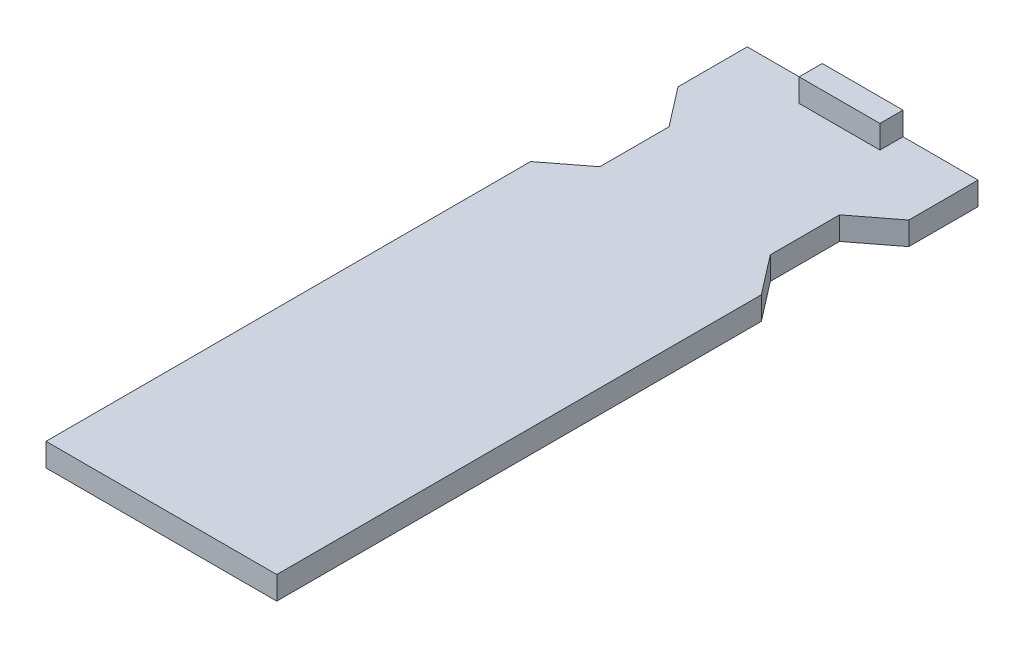
ISO-10303-21;
HEADER;
FILE_DESCRIPTION(('STEP AP214'),'2;1');
FILE_NAME('part.step','',(''),(''),'','','');
FILE_SCHEMA(('AUTOMOTIVE_DESIGN { 1 0 10303 214 1 1 1 1 }'));
ENDSEC;
DATA;
#1=APPLICATION_CONTEXT('core data for automotive mechanical design processes');
#2=APPLICATION_PROTOCOL_DEFINITION('international standard','automotive_design',2000,#1);
#3=PRODUCT_CONTEXT('',#1,'mechanical');
#4=PRODUCT('Part','Part','',(#3));
#5=PRODUCT_RELATED_PRODUCT_CATEGORY('part','',(#4));
#6=PRODUCT_DEFINITION_FORMATION('','',#4);
#7=PRODUCT_DEFINITION_CONTEXT('part definition',#1,'design');
#8=PRODUCT_DEFINITION('design','',#6,#7);
#9=PRODUCT_DEFINITION_SHAPE('','',#8);
#10=(LENGTH_UNIT() NAMED_UNIT(*) SI_UNIT(.MILLI.,.METRE.));
#11=(NAMED_UNIT(*) PLANE_ANGLE_UNIT() SI_UNIT($,.RADIAN.));
#12=(NAMED_UNIT(*) SI_UNIT($,.STERADIAN.) SOLID_ANGLE_UNIT());
#13=UNCERTAINTY_MEASURE_WITH_UNIT(LENGTH_MEASURE(1.E-05),#10,'distance_accuracy_value','');
#14=(GEOMETRIC_REPRESENTATION_CONTEXT(3) GLOBAL_UNCERTAINTY_ASSIGNED_CONTEXT((#13)) GLOBAL_UNIT_ASSIGNED_CONTEXT((#10,
#11,#12)) REPRESENTATION_CONTEXT('',''));
#15=CARTESIAN_POINT('',(0.,0.,0.));
#16=DIRECTION('',(0.,0.,1.));
#17=DIRECTION('',(1.,0.,0.));
#18=AXIS2_PLACEMENT_3D('',#15,#16,#17);
#19=CARTESIAN_POINT('',(7.27930973975201,4.,-60.));
#20=DIRECTION('',(1.,0.,0.));
#21=DIRECTION('',(0.,0.,-1.));
#22=AXIS2_PLACEMENT_3D('',#19,#20,#21);
#23=PLANE('',#22);
#24=DIRECTION('',(0.,0.,1.));
#25=VECTOR('',#24,1.);
#26=CARTESIAN_POINT('',(7.27930973975201,2.,-60.));
#27=LINE('',#26,#25);
#28=CARTESIAN_POINT('',(7.27930973975201,2.,-60.));
#29=VERTEX_POINT('',#28);
#30=CARTESIAN_POINT('',(7.27930973975201,2.,-58.));
#31=VERTEX_POINT('',#30);
#32=EDGE_CURVE('E108',#29,#31,#27,.T.);
#33=ORIENTED_EDGE('',*,*,#32,.T.);
#34=DIRECTION('',(0.,-1.,0.));
#35=VECTOR('',#34,1.);
#36=CARTESIAN_POINT('',(7.27930973975201,4.,-58.));
#37=LINE('',#36,#35);
#38=CARTESIAN_POINT('',(7.27930973975201,4.,-58.));
#39=VERTEX_POINT('',#38);
#40=EDGE_CURVE('E12',#39,#31,#37,.T.);
#41=ORIENTED_EDGE('',*,*,#40,.F.);
#42=DIRECTION('',(0.,0.,1.));
#43=VECTOR('',#42,1.);
#44=CARTESIAN_POINT('',(7.27930973975201,4.,-60.));
#45=LINE('',#44,#43);
#46=CARTESIAN_POINT('',(7.27930973975201,4.,-60.));
#47=VERTEX_POINT('',#46);
#48=EDGE_CURVE('E96',#47,#39,#45,.T.);
#49=ORIENTED_EDGE('',*,*,#48,.F.);
#50=DIRECTION('',(0.,-1.,0.));
#51=VECTOR('',#50,1.);
#52=CARTESIAN_POINT('',(7.27930973975201,4.,-60.));
#53=LINE('',#52,#51);
#54=EDGE_CURVE('E104',#47,#29,#53,.T.);
#55=ORIENTED_EDGE('',*,*,#54,.T.);
#56=EDGE_LOOP('',(#33,#41,#49,#55));
#57=FACE_BOUND('',#56,.T.);
#58=ADVANCED_FACE('F45',(#57),#23,.F.);
#59=CARTESIAN_POINT('',(7.27930973975201,4.,-58.));
#60=DIRECTION('',(0.,0.,-1.));
#61=DIRECTION('',(-1.,0.,0.));
#62=AXIS2_PLACEMENT_3D('',#59,#60,#61);
#63=PLANE('',#62);
#64=DIRECTION('',(1.,0.,0.));
#65=VECTOR('',#64,1.);
#66=CARTESIAN_POINT('',(7.27930973975201,2.,-58.));
#67=LINE('',#66,#65);
#68=CARTESIAN_POINT('',(14.279309739752,2.,-58.));
#69=VERTEX_POINT('',#68);
#70=EDGE_CURVE('E100',#31,#69,#67,.T.);
#71=ORIENTED_EDGE('',*,*,#70,.T.);
#72=DIRECTION('',(0.,-1.,0.));
#73=VECTOR('',#72,1.);
#74=CARTESIAN_POINT('',(14.279309739752,4.,-58.));
#75=LINE('',#74,#73);
#76=CARTESIAN_POINT('',(14.279309739752,4.,-58.));
#77=VERTEX_POINT('',#76);
#78=EDGE_CURVE('E53',#77,#69,#75,.T.);
#79=ORIENTED_EDGE('',*,*,#78,.F.);
#80=DIRECTION('',(1.,0.,0.));
#81=VECTOR('',#80,1.);
#82=CARTESIAN_POINT('',(7.27930973975201,4.,-58.));
#83=LINE('',#82,#81);
#84=EDGE_CURVE('E91',#39,#77,#83,.T.);
#85=ORIENTED_EDGE('',*,*,#84,.F.);
#86=ORIENTED_EDGE('',*,*,#40,.T.);
#87=EDGE_LOOP('',(#71,#79,#85,#86));
#88=FACE_BOUND('',#87,.T.);
#89=ADVANCED_FACE('F99',(#88),#63,.F.);
#90=CARTESIAN_POINT('',(14.279309739752,4.,-60.));
#91=DIRECTION('',(-1.,0.,0.));
#92=DIRECTION('',(0.,0.,1.));
#93=AXIS2_PLACEMENT_3D('',#90,#91,#92);
#94=PLANE('',#93);
#95=DIRECTION('',(0.,0.,-1.));
#96=VECTOR('',#95,1.);
#97=CARTESIAN_POINT('',(14.279309739752,2.,-60.));
#98=LINE('',#97,#96);
#99=CARTESIAN_POINT('',(14.279309739752,2.,-60.));
#100=VERTEX_POINT('',#99);
#101=EDGE_CURVE('E78',#69,#100,#98,.T.);
#102=ORIENTED_EDGE('',*,*,#101,.T.);
#103=DIRECTION('',(0.,-1.,0.));
#104=VECTOR('',#103,1.);
#105=CARTESIAN_POINT('',(14.279309739752,4.,-60.));
#106=LINE('',#105,#104);
#107=CARTESIAN_POINT('',(14.279309739752,4.,-60.));
#108=VERTEX_POINT('',#107);
#109=EDGE_CURVE('E101',#108,#100,#106,.T.);
#110=ORIENTED_EDGE('',*,*,#109,.F.);
#111=DIRECTION('',(0.,0.,-1.));
#112=VECTOR('',#111,1.);
#113=CARTESIAN_POINT('',(14.279309739752,4.,-60.));
#114=LINE('',#113,#112);
#115=EDGE_CURVE('E94',#77,#108,#114,.T.);
#116=ORIENTED_EDGE('',*,*,#115,.F.);
#117=ORIENTED_EDGE('',*,*,#78,.T.);
#118=EDGE_LOOP('',(#102,#110,#116,#117));
#119=FACE_BOUND('',#118,.T.);
#120=ADVANCED_FACE('F102',(#119),#94,.F.);
#121=CARTESIAN_POINT('',(7.27930973975201,4.,-60.));
#122=DIRECTION('',(0.,0.,1.));
#123=DIRECTION('',(1.,0.,0.));
#124=AXIS2_PLACEMENT_3D('',#121,#122,#123);
#125=PLANE('',#124);
#126=DIRECTION('',(-1.,0.,0.));
#127=VECTOR('',#126,1.);
#128=CARTESIAN_POINT('',(7.27930973975201,2.,-60.));
#129=LINE('',#128,#127);
#130=EDGE_CURVE('E84',#100,#29,#129,.T.);
#131=ORIENTED_EDGE('',*,*,#130,.T.);
#132=ORIENTED_EDGE('',*,*,#54,.F.);
#133=DIRECTION('',(-1.,0.,0.));
#134=VECTOR('',#133,1.);
#135=CARTESIAN_POINT('',(7.27930973975201,4.,-60.));
#136=LINE('',#135,#134);
#137=EDGE_CURVE('E61',#108,#47,#136,.T.);
#138=ORIENTED_EDGE('',*,*,#137,.F.);
#139=ORIENTED_EDGE('',*,*,#109,.T.);
#140=EDGE_LOOP('',(#131,#132,#138,#139));
#141=FACE_BOUND('',#140,.T.);
#142=ADVANCED_FACE('F115',(#141),#125,.F.);
#143=CARTESIAN_POINT('',(0.,4.,0.));
#144=DIRECTION('',(0.,1.,0.));
#145=DIRECTION('',(0.,0.,1.));
#146=AXIS2_PLACEMENT_3D('',#143,#144,#145);
#147=PLANE('',#146);
#148=ORIENTED_EDGE('',*,*,#48,.T.);
#149=ORIENTED_EDGE('',*,*,#84,.T.);
#150=ORIENTED_EDGE('',*,*,#115,.T.);
#151=ORIENTED_EDGE('',*,*,#137,.T.);
#152=EDGE_LOOP('',(#148,#149,#150,#151));
#153=FACE_BOUND('',#152,.T.);
#154=ADVANCED_FACE('F92',(#153),#147,.T.);
#155=CARTESIAN_POINT('',(0.,2.,0.));
#156=DIRECTION('',(0.,1.,0.));
#157=DIRECTION('',(0.,0.,1.));
#158=AXIS2_PLACEMENT_3D('',#155,#156,#157);
#159=PLANE('',#158);
#160=ORIENTED_EDGE('',*,*,#32,.F.);
#161=ORIENTED_EDGE('',*,*,#130,.F.);
#162=ORIENTED_EDGE('',*,*,#101,.F.);
#163=ORIENTED_EDGE('',*,*,#70,.F.);
#164=EDGE_LOOP('',(#160,#161,#162,#163));
#165=FACE_BOUND('',#164,.T.);
#166=ADVANCED_FACE('F118',(#165),#159,.F.);
#167=CLOSED_SHELL('',(#58,#89,#120,#142,#154,#166));
#168=MANIFOLD_SOLID_BREP('B2',#167);
#169=CARTESIAN_POINT('',(0.,2.,0.));
#170=DIRECTION('',(0.,0.,-1.));
#171=DIRECTION('',(-1.,0.,0.));
#172=AXIS2_PLACEMENT_3D('',#169,#170,#171);
#173=PLANE('',#172);
#174=DIRECTION('',(1.,0.,0.));
#175=VECTOR('',#174,1.);
#176=CARTESIAN_POINT('',(0.,0.,0.));
#177=LINE('',#176,#175);
#178=CARTESIAN_POINT('',(0.,0.,0.));
#179=VERTEX_POINT('',#178);
#180=CARTESIAN_POINT('',(20.,0.,0.));
#181=VERTEX_POINT('',#180);
#182=EDGE_CURVE('E289',#179,#181,#177,.T.);
#183=ORIENTED_EDGE('',*,*,#182,.T.);
#184=DIRECTION('',(0.,-1.,0.));
#185=VECTOR('',#184,1.);
#186=CARTESIAN_POINT('',(20.,2.,0.));
#187=LINE('',#186,#185);
#188=CARTESIAN_POINT('',(20.,2.,0.));
#189=VERTEX_POINT('',#188);
#190=EDGE_CURVE('E43',#189,#181,#187,.T.);
#191=ORIENTED_EDGE('',*,*,#190,.F.);
#192=DIRECTION('',(1.,0.,0.));
#193=VECTOR('',#192,1.);
#194=CARTESIAN_POINT('',(0.,2.,0.));
#195=LINE('',#194,#193);
#196=CARTESIAN_POINT('',(0.,2.,0.));
#197=VERTEX_POINT('',#196);
#198=EDGE_CURVE('E311',#197,#189,#195,.T.);
#199=ORIENTED_EDGE('',*,*,#198,.F.);
#200=DIRECTION('',(0.,-1.,0.));
#201=VECTOR('',#200,1.);
#202=CARTESIAN_POINT('',(0.,2.,0.));
#203=LINE('',#202,#201);
#204=EDGE_CURVE('E285',#197,#179,#203,.T.);
#205=ORIENTED_EDGE('',*,*,#204,.T.);
#206=EDGE_LOOP('',(#183,#191,#199,#205));
#207=FACE_BOUND('',#206,.T.);
#208=ADVANCED_FACE('F169',(#207),#173,.F.);
#209=CARTESIAN_POINT('',(20.,2.,0.));
#210=DIRECTION('',(-1.,0.,0.));
#211=DIRECTION('',(0.,0.,1.));
#212=AXIS2_PLACEMENT_3D('',#209,#210,#211);
#213=PLANE('',#212);
#214=DIRECTION('',(0.,0.,-1.));
#215=VECTOR('',#214,1.);
#216=CARTESIAN_POINT('',(20.,0.,0.));
#217=LINE('',#216,#215);
#218=CARTESIAN_POINT('',(20.,0.,-42.));
#219=VERTEX_POINT('',#218);
#220=EDGE_CURVE('E292',#181,#219,#217,.T.);
#221=ORIENTED_EDGE('',*,*,#220,.T.);
#222=DIRECTION('',(0.,-1.,0.));
#223=VECTOR('',#222,1.);
#224=CARTESIAN_POINT('',(20.,2.,-42.));
#225=LINE('',#224,#223);
#226=CARTESIAN_POINT('',(20.,2.,-42.));
#227=VERTEX_POINT('',#226);
#228=EDGE_CURVE('E177',#227,#219,#225,.T.);
#229=ORIENTED_EDGE('',*,*,#228,.F.);
#230=DIRECTION('',(0.,0.,-1.));
#231=VECTOR('',#230,1.);
#232=CARTESIAN_POINT('',(20.,2.,0.));
#233=LINE('',#232,#231);
#234=EDGE_CURVE('E240',#189,#227,#233,.T.);
#235=ORIENTED_EDGE('',*,*,#234,.F.);
#236=ORIENTED_EDGE('',*,*,#190,.T.);
#237=EDGE_LOOP('',(#221,#229,#235,#236));
#238=FACE_BOUND('',#237,.T.);
#239=ADVANCED_FACE('F389',(#238),#213,.F.);
#240=CARTESIAN_POINT('',(20.,2.,-42.));
#241=DIRECTION('',(-0.7922942232558,0.,0.610139216732943));
#242=DIRECTION('',(0.610139216732943,0.,0.7922942232558));
#243=AXIS2_PLACEMENT_3D('',#240,#241,#242);
#244=PLANE('',#243);
#245=DIRECTION('',(-0.610139216732943,0.,-0.7922942232558));
#246=VECTOR('',#245,1.);
#247=CARTESIAN_POINT('',(20.,0.,-42.));
#248=LINE('',#247,#246);
#249=CARTESIAN_POINT('',(17.389654869876,0.,-45.389654869876));
#250=VERTEX_POINT('',#249);
#251=EDGE_CURVE('E294',#219,#250,#248,.T.);
#252=ORIENTED_EDGE('',*,*,#251,.T.);
#253=DIRECTION('',(0.,-1.,0.));
#254=VECTOR('',#253,1.);
#255=CARTESIAN_POINT('',(17.389654869876,2.,-45.389654869876));
#256=LINE('',#255,#254);
#257=CARTESIAN_POINT('',(17.389654869876,2.,-45.389654869876));
#258=VERTEX_POINT('',#257);
#259=EDGE_CURVE('E330',#258,#250,#256,.T.);
#260=ORIENTED_EDGE('',*,*,#259,.F.);
#261=DIRECTION('',(-0.610139216732943,0.,-0.7922942232558));
#262=VECTOR('',#261,1.);
#263=CARTESIAN_POINT('',(20.,2.,-42.));
#264=LINE('',#263,#262);
#265=EDGE_CURVE('E338',#227,#258,#264,.T.);
#266=ORIENTED_EDGE('',*,*,#265,.F.);
#267=ORIENTED_EDGE('',*,*,#228,.T.);
#268=EDGE_LOOP('',(#252,#260,#266,#267));
#269=FACE_BOUND('',#268,.T.);
#270=ADVANCED_FACE('F336',(#269),#244,.F.);
#271=CARTESIAN_POINT('',(17.389654869876,2.,-45.389654869876));
#272=DIRECTION('',(-1.,0.,0.));
#273=DIRECTION('',(0.,0.,1.));
#274=AXIS2_PLACEMENT_3D('',#271,#272,#273);
#275=PLANE('',#274);
#276=DIRECTION('',(0.,0.,-1.));
#277=VECTOR('',#276,1.);
#278=CARTESIAN_POINT('',(17.389654869876,0.,-45.389654869876));
#279=LINE('',#278,#277);
#280=CARTESIAN_POINT('',(17.389654869876,0.,-51.389654869876));
#281=VERTEX_POINT('',#280);
#282=EDGE_CURVE('E296',#250,#281,#279,.T.);
#283=ORIENTED_EDGE('',*,*,#282,.T.);
#284=DIRECTION('',(0.,-1.,0.));
#285=VECTOR('',#284,1.);
#286=CARTESIAN_POINT('',(17.389654869876,2.,-51.389654869876));
#287=LINE('',#286,#285);
#288=CARTESIAN_POINT('',(17.389654869876,2.,-51.389654869876));
#289=VERTEX_POINT('',#288);
#290=EDGE_CURVE('E327',#289,#281,#287,.T.);
#291=ORIENTED_EDGE('',*,*,#290,.F.);
#292=DIRECTION('',(0.,0.,-1.));
#293=VECTOR('',#292,1.);
#294=CARTESIAN_POINT('',(17.389654869876,2.,-45.389654869876));
#295=LINE('',#294,#293);
#296=EDGE_CURVE('E356',#258,#289,#295,.T.);
#297=ORIENTED_EDGE('',*,*,#296,.F.);
#298=ORIENTED_EDGE('',*,*,#259,.T.);
#299=EDGE_LOOP('',(#283,#291,#297,#298));
#300=FACE_BOUND('',#299,.T.);
#301=ADVANCED_FACE('F347',(#300),#275,.F.);
#302=CARTESIAN_POINT('',(17.389654869876,2.,-51.389654869876));
#303=DIRECTION('',(-0.610139216732944,0.,-0.792294223255799));
#304=DIRECTION('',(-0.792294223255799,0.,0.610139216732944));
#305=AXIS2_PLACEMENT_3D('',#302,#303,#304);
#306=PLANE('',#305);
#307=DIRECTION('',(0.792294223255799,0.,-0.610139216732944));
#308=VECTOR('',#307,1.);
#309=CARTESIAN_POINT('',(17.389654869876,0.,-51.389654869876));
#310=LINE('',#309,#308);
#311=CARTESIAN_POINT('',(20.779309739752,0.,-54.));
#312=VERTEX_POINT('',#311);
#313=EDGE_CURVE('E298',#281,#312,#310,.T.);
#314=ORIENTED_EDGE('',*,*,#313,.T.);
#315=DIRECTION('',(0.,-1.,0.));
#316=VECTOR('',#315,1.);
#317=CARTESIAN_POINT('',(20.779309739752,2.,-54.));
#318=LINE('',#317,#316);
#319=CARTESIAN_POINT('',(20.779309739752,2.,-54.));
#320=VERTEX_POINT('',#319);
#321=EDGE_CURVE('E324',#320,#312,#318,.T.);
#322=ORIENTED_EDGE('',*,*,#321,.F.);
#323=DIRECTION('',(0.792294223255799,0.,-0.610139216732944));
#324=VECTOR('',#323,1.);
#325=CARTESIAN_POINT('',(17.389654869876,2.,-51.389654869876));
#326=LINE('',#325,#324);
#327=EDGE_CURVE('E353',#289,#320,#326,.T.);
#328=ORIENTED_EDGE('',*,*,#327,.F.);
#329=ORIENTED_EDGE('',*,*,#290,.T.);
#330=EDGE_LOOP('',(#314,#322,#328,#329));
#331=FACE_BOUND('',#330,.T.);
#332=ADVANCED_FACE('F351',(#331),#306,.F.);
#333=CARTESIAN_POINT('',(20.779309739752,2.,-54.));
#334=DIRECTION('',(-1.,0.,0.));
#335=DIRECTION('',(0.,0.,1.));
#336=AXIS2_PLACEMENT_3D('',#333,#334,#335);
#337=PLANE('',#336);
#338=DIRECTION('',(0.,0.,-1.));
#339=VECTOR('',#338,1.);
#340=CARTESIAN_POINT('',(20.779309739752,0.,-54.));
#341=LINE('',#340,#339);
#342=CARTESIAN_POINT('',(20.779309739752,0.,-60.));
#343=VERTEX_POINT('',#342);
#344=EDGE_CURVE('E300',#312,#343,#341,.T.);
#345=ORIENTED_EDGE('',*,*,#344,.T.);
#346=DIRECTION('',(0.,-1.,0.));
#347=VECTOR('',#346,1.);
#348=CARTESIAN_POINT('',(20.779309739752,2.,-60.));
#349=LINE('',#348,#347);
#350=CARTESIAN_POINT('',(20.779309739752,2.,-60.));
#351=VERTEX_POINT('',#350);
#352=EDGE_CURVE('E321',#351,#343,#349,.T.);
#353=ORIENTED_EDGE('',*,*,#352,.F.);
#354=DIRECTION('',(0.,0.,-1.));
#355=VECTOR('',#354,1.);
#356=CARTESIAN_POINT('',(20.779309739752,2.,-54.));
#357=LINE('',#356,#355);
#358=EDGE_CURVE('E355',#320,#351,#357,.T.);
#359=ORIENTED_EDGE('',*,*,#358,.F.);
#360=ORIENTED_EDGE('',*,*,#321,.T.);
#361=EDGE_LOOP('',(#345,#353,#359,#360));
#362=FACE_BOUND('',#361,.T.);
#363=ADVANCED_FACE('F402',(#362),#337,.F.);
#364=CARTESIAN_POINT('',(20.779309739752,2.,-60.));
#365=DIRECTION('',(0.,0.,1.));
#366=DIRECTION('',(1.,0.,0.));
#367=AXIS2_PLACEMENT_3D('',#364,#365,#366);
#368=PLANE('',#367);
#369=DIRECTION('',(-1.,0.,0.));
#370=VECTOR('',#369,1.);
#371=CARTESIAN_POINT('',(20.779309739752,0.,-60.));
#372=LINE('',#371,#370);
#373=CARTESIAN_POINT('',(0.779309739752008,0.,-60.));
#374=VERTEX_POINT('',#373);
#375=EDGE_CURVE('E302',#343,#374,#372,.T.);
#376=ORIENTED_EDGE('',*,*,#375,.T.);
#377=DIRECTION('',(0.,-1.,0.));
#378=VECTOR('',#377,1.);
#379=CARTESIAN_POINT('',(0.779309739752008,2.,-60.));
#380=LINE('',#379,#378);
#381=CARTESIAN_POINT('',(0.779309739752008,2.,-60.));
#382=VERTEX_POINT('',#381);
#383=EDGE_CURVE('E318',#382,#374,#380,.T.);
#384=ORIENTED_EDGE('',*,*,#383,.F.);
#385=DIRECTION('',(-1.,0.,0.));
#386=VECTOR('',#385,1.);
#387=CARTESIAN_POINT('',(20.779309739752,2.,-60.));
#388=LINE('',#387,#386);
#389=EDGE_CURVE('E358',#351,#382,#388,.T.);
#390=ORIENTED_EDGE('',*,*,#389,.F.);
#391=ORIENTED_EDGE('',*,*,#352,.T.);
#392=EDGE_LOOP('',(#376,#384,#390,#391));
#393=FACE_BOUND('',#392,.T.);
#394=ADVANCED_FACE('F405',(#393),#368,.F.);
#395=CARTESIAN_POINT('',(0.779309739752008,2.,-60.));
#396=DIRECTION('',(1.,0.,0.));
#397=DIRECTION('',(0.,0.,-1.));
#398=AXIS2_PLACEMENT_3D('',#395,#396,#397);
#399=PLANE('',#398);
#400=DIRECTION('',(0.,0.,1.));
#401=VECTOR('',#400,1.);
#402=CARTESIAN_POINT('',(0.779309739752008,0.,-60.));
#403=LINE('',#402,#401);
#404=CARTESIAN_POINT('',(0.779309739752008,0.,-54.));
#405=VERTEX_POINT('',#404);
#406=EDGE_CURVE('E304',#374,#405,#403,.T.);
#407=ORIENTED_EDGE('',*,*,#406,.T.);
#408=DIRECTION('',(0.,-1.,0.));
#409=VECTOR('',#408,1.);
#410=CARTESIAN_POINT('',(0.779309739752008,2.,-54.));
#411=LINE('',#410,#409);
#412=CARTESIAN_POINT('',(0.779309739752008,2.,-54.));
#413=VERTEX_POINT('',#412);
#414=EDGE_CURVE('E315',#413,#405,#411,.T.);
#415=ORIENTED_EDGE('',*,*,#414,.F.);
#416=DIRECTION('',(0.,0.,1.));
#417=VECTOR('',#416,1.);
#418=CARTESIAN_POINT('',(0.779309739752008,2.,-60.));
#419=LINE('',#418,#417);
#420=EDGE_CURVE('E364',#382,#413,#419,.T.);
#421=ORIENTED_EDGE('',*,*,#420,.F.);
#422=ORIENTED_EDGE('',*,*,#383,.T.);
#423=EDGE_LOOP('',(#407,#415,#421,#422));
#424=FACE_BOUND('',#423,.T.);
#425=ADVANCED_FACE('F370',(#424),#399,.F.);
#426=CARTESIAN_POINT('',(0.779309739752008,2.,-54.));
#427=DIRECTION('',(0.7922942232558,0.,-0.610139216732943));
#428=DIRECTION('',(-0.610139216732943,0.,-0.7922942232558));
#429=AXIS2_PLACEMENT_3D('',#426,#427,#428);
#430=PLANE('',#429);
#431=DIRECTION('',(0.610139216732943,0.,0.7922942232558));
#432=VECTOR('',#431,1.);
#433=CARTESIAN_POINT('',(0.779309739752008,0.,-54.));
#434=LINE('',#433,#432);
#435=CARTESIAN_POINT('',(3.389654869876,0.,-50.610345130124));
#436=VERTEX_POINT('',#435);
#437=EDGE_CURVE('E306',#405,#436,#434,.T.);
#438=ORIENTED_EDGE('',*,*,#437,.T.);
#439=DIRECTION('',(0.,-1.,0.));
#440=VECTOR('',#439,1.);
#441=CARTESIAN_POINT('',(3.389654869876,2.,-50.610345130124));
#442=LINE('',#441,#440);
#443=CARTESIAN_POINT('',(3.389654869876,2.,-50.610345130124));
#444=VERTEX_POINT('',#443);
#445=EDGE_CURVE('E280',#444,#436,#442,.T.);
#446=ORIENTED_EDGE('',*,*,#445,.F.);
#447=DIRECTION('',(0.610139216732943,0.,0.7922942232558));
#448=VECTOR('',#447,1.);
#449=CARTESIAN_POINT('',(0.779309739752008,2.,-54.));
#450=LINE('',#449,#448);
#451=EDGE_CURVE('E271',#413,#444,#450,.T.);
#452=ORIENTED_EDGE('',*,*,#451,.F.);
#453=ORIENTED_EDGE('',*,*,#414,.T.);
#454=EDGE_LOOP('',(#438,#446,#452,#453));
#455=FACE_BOUND('',#454,.T.);
#456=ADVANCED_FACE('F374',(#455),#430,.F.);
#457=CARTESIAN_POINT('',(3.389654869876,2.,-50.610345130124));
#458=DIRECTION('',(1.,0.,0.));
#459=DIRECTION('',(0.,0.,-1.));
#460=AXIS2_PLACEMENT_3D('',#457,#458,#459);
#461=PLANE('',#460);
#462=DIRECTION('',(0.,0.,1.));
#463=VECTOR('',#462,1.);
#464=CARTESIAN_POINT('',(3.389654869876,0.,-50.610345130124));
#465=LINE('',#464,#463);
#466=CARTESIAN_POINT('',(3.389654869876,0.,-44.610345130124));
#467=VERTEX_POINT('',#466);
#468=EDGE_CURVE('E279',#436,#467,#465,.T.);
#469=ORIENTED_EDGE('',*,*,#468,.T.);
#470=DIRECTION('',(0.,-1.,0.));
#471=VECTOR('',#470,1.);
#472=CARTESIAN_POINT('',(3.389654869876,2.,-44.610345130124));
#473=LINE('',#472,#471);
#474=CARTESIAN_POINT('',(3.389654869876,2.,-44.610345130124));
#475=VERTEX_POINT('',#474);
#476=EDGE_CURVE('E276',#475,#467,#473,.T.);
#477=ORIENTED_EDGE('',*,*,#476,.F.);
#478=DIRECTION('',(0.,0.,1.));
#479=VECTOR('',#478,1.);
#480=CARTESIAN_POINT('',(3.389654869876,2.,-50.610345130124));
#481=LINE('',#480,#479);
#482=EDGE_CURVE('E265',#444,#475,#481,.T.);
#483=ORIENTED_EDGE('',*,*,#482,.F.);
#484=ORIENTED_EDGE('',*,*,#445,.T.);
#485=EDGE_LOOP('',(#469,#477,#483,#484));
#486=FACE_BOUND('',#485,.T.);
#487=ADVANCED_FACE('F277',(#486),#461,.F.);
#488=CARTESIAN_POINT('',(3.389654869876,2.,-44.610345130124));
#489=DIRECTION('',(0.610139216732944,0.,0.792294223255799));
#490=DIRECTION('',(0.792294223255799,0.,-0.610139216732944));
#491=AXIS2_PLACEMENT_3D('',#488,#489,#490);
#492=PLANE('',#491);
#493=DIRECTION('',(-0.792294223255799,0.,0.610139216732944));
#494=VECTOR('',#493,1.);
#495=CARTESIAN_POINT('',(3.389654869876,0.,-44.610345130124));
#496=LINE('',#495,#494);
#497=CARTESIAN_POINT('',(0.,0.,-42.));
#498=VERTEX_POINT('',#497);
#499=EDGE_CURVE('E226',#467,#498,#496,.T.);
#500=ORIENTED_EDGE('',*,*,#499,.T.);
#501=DIRECTION('',(0.,-1.,0.));
#502=VECTOR('',#501,1.);
#503=CARTESIAN_POINT('',(0.,2.,-42.));
#504=LINE('',#503,#502);
#505=CARTESIAN_POINT('',(0.,2.,-42.));
#506=VERTEX_POINT('',#505);
#507=EDGE_CURVE('E281',#506,#498,#504,.T.);
#508=ORIENTED_EDGE('',*,*,#507,.F.);
#509=DIRECTION('',(-0.792294223255799,0.,0.610139216732944));
#510=VECTOR('',#509,1.);
#511=CARTESIAN_POINT('',(3.389654869876,2.,-44.610345130124));
#512=LINE('',#511,#510);
#513=EDGE_CURVE('E269',#475,#506,#512,.T.);
#514=ORIENTED_EDGE('',*,*,#513,.F.);
#515=ORIENTED_EDGE('',*,*,#476,.T.);
#516=EDGE_LOOP('',(#500,#508,#514,#515));
#517=FACE_BOUND('',#516,.T.);
#518=ADVANCED_FACE('F283',(#517),#492,.F.);
#519=CARTESIAN_POINT('',(0.,2.,-42.));
#520=DIRECTION('',(1.,0.,0.));
#521=DIRECTION('',(0.,0.,-1.));
#522=AXIS2_PLACEMENT_3D('',#519,#520,#521);
#523=PLANE('',#522);
#524=DIRECTION('',(0.,0.,1.));
#525=VECTOR('',#524,1.);
#526=CARTESIAN_POINT('',(0.,0.,-42.));
#527=LINE('',#526,#525);
#528=EDGE_CURVE('E232',#498,#179,#527,.T.);
#529=ORIENTED_EDGE('',*,*,#528,.T.);
#530=ORIENTED_EDGE('',*,*,#204,.F.);
#531=DIRECTION('',(0.,0.,1.));
#532=VECTOR('',#531,1.);
#533=CARTESIAN_POINT('',(0.,2.,-42.));
#534=LINE('',#533,#532);
#535=EDGE_CURVE('E185',#506,#197,#534,.T.);
#536=ORIENTED_EDGE('',*,*,#535,.F.);
#537=ORIENTED_EDGE('',*,*,#507,.T.);
#538=EDGE_LOOP('',(#529,#530,#536,#537));
#539=FACE_BOUND('',#538,.T.);
#540=ADVANCED_FACE('F378',(#539),#523,.F.);
#541=CARTESIAN_POINT('',(0.,2.,0.));
#542=DIRECTION('',(0.,1.,0.));
#543=DIRECTION('',(0.,0.,1.));
#544=AXIS2_PLACEMENT_3D('',#541,#542,#543);
#545=PLANE('',#544);
#546=ORIENTED_EDGE('',*,*,#198,.T.);
#547=ORIENTED_EDGE('',*,*,#234,.T.);
#548=ORIENTED_EDGE('',*,*,#265,.T.);
#549=ORIENTED_EDGE('',*,*,#296,.T.);
#550=ORIENTED_EDGE('',*,*,#327,.T.);
#551=ORIENTED_EDGE('',*,*,#358,.T.);
#552=ORIENTED_EDGE('',*,*,#389,.T.);
#553=ORIENTED_EDGE('',*,*,#420,.T.);
#554=ORIENTED_EDGE('',*,*,#451,.T.);
#555=ORIENTED_EDGE('',*,*,#482,.T.);
#556=ORIENTED_EDGE('',*,*,#513,.T.);
#557=ORIENTED_EDGE('',*,*,#535,.T.);
#558=EDGE_LOOP('',(#546,#547,#548,#549,#550,#551,#552,#553,#554,#555,#556,#557));
#559=FACE_BOUND('',#558,.T.);
#560=ADVANCED_FACE('F267',(#559),#545,.T.);
#561=CARTESIAN_POINT('',(0.,0.,0.));
#562=DIRECTION('',(0.,1.,0.));
#563=DIRECTION('',(0.,0.,1.));
#564=AXIS2_PLACEMENT_3D('',#561,#562,#563);
#565=PLANE('',#564);
#566=ORIENTED_EDGE('',*,*,#182,.F.);
#567=ORIENTED_EDGE('',*,*,#528,.F.);
#568=ORIENTED_EDGE('',*,*,#499,.F.);
#569=ORIENTED_EDGE('',*,*,#468,.F.);
#570=ORIENTED_EDGE('',*,*,#437,.F.);
#571=ORIENTED_EDGE('',*,*,#406,.F.);
#572=ORIENTED_EDGE('',*,*,#375,.F.);
#573=ORIENTED_EDGE('',*,*,#344,.F.);
#574=ORIENTED_EDGE('',*,*,#313,.F.);
#575=ORIENTED_EDGE('',*,*,#282,.F.);
#576=ORIENTED_EDGE('',*,*,#251,.F.);
#577=ORIENTED_EDGE('',*,*,#220,.F.);
#578=EDGE_LOOP('',(#566,#567,#568,#569,#570,#571,#572,#573,#574,#575,#576,#577));
#579=FACE_BOUND('',#578,.T.);
#580=ADVANCED_FACE('F342',(#579),#565,.F.);
#581=CLOSED_SHELL('',(#208,#239,#270,#301,#332,#363,#394,#425,#456,#487,#518,#540,#560,#580));
#582=MANIFOLD_SOLID_BREP('B6',#581);
#583=ADVANCED_BREP_SHAPE_REPRESENTATION('',(#18,#168,#582),#14);
#584=SHAPE_DEFINITION_REPRESENTATION(#9,#583);
ENDSEC;
END-ISO-10303-21;
